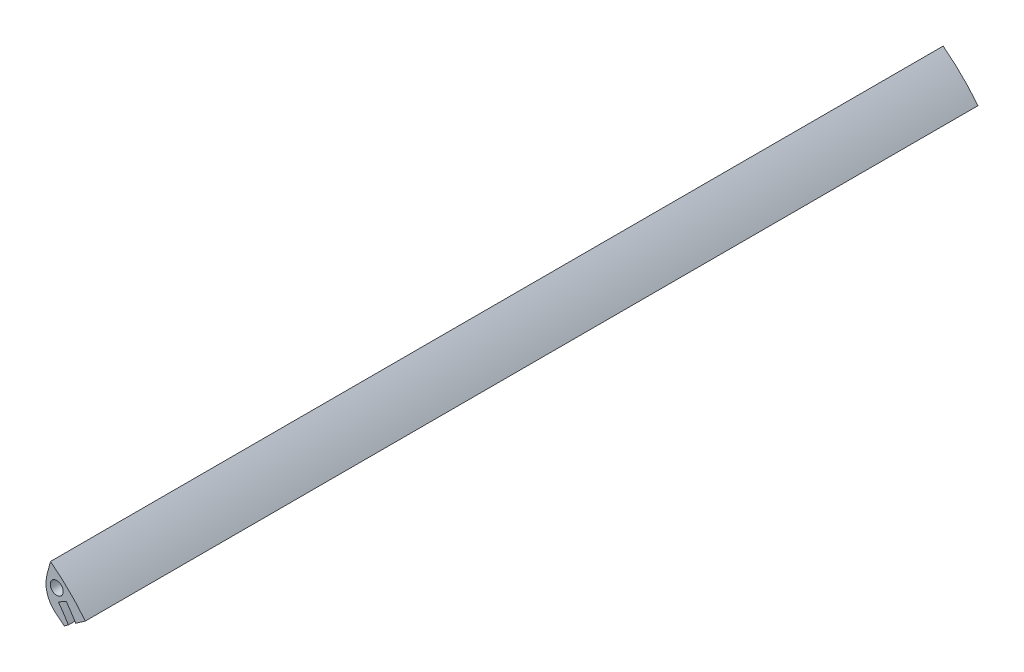
ISO-10303-21;
HEADER;
FILE_DESCRIPTION(('STEP AP214'),'2;1');
FILE_NAME('part.step','',(''),(''),'','','');
FILE_SCHEMA(('AUTOMOTIVE_DESIGN { 1 0 10303 214 1 1 1 1 }'));
ENDSEC;
DATA;
#1=APPLICATION_CONTEXT('core data for automotive mechanical design processes');
#2=APPLICATION_PROTOCOL_DEFINITION('international standard','automotive_design',2000,#1);
#3=PRODUCT_CONTEXT('',#1,'mechanical');
#4=PRODUCT('Part','Part','',(#3));
#5=PRODUCT_RELATED_PRODUCT_CATEGORY('part','',(#4));
#6=PRODUCT_DEFINITION_FORMATION('','',#4);
#7=PRODUCT_DEFINITION_CONTEXT('part definition',#1,'design');
#8=PRODUCT_DEFINITION('design','',#6,#7);
#9=PRODUCT_DEFINITION_SHAPE('','',#8);
#10=(LENGTH_UNIT() NAMED_UNIT(*) SI_UNIT(.MILLI.,.METRE.));
#11=(NAMED_UNIT(*) PLANE_ANGLE_UNIT() SI_UNIT($,.RADIAN.));
#12=(NAMED_UNIT(*) SI_UNIT($,.STERADIAN.) SOLID_ANGLE_UNIT());
#13=UNCERTAINTY_MEASURE_WITH_UNIT(LENGTH_MEASURE(1.E-05),#10,'distance_accuracy_value','');
#14=(GEOMETRIC_REPRESENTATION_CONTEXT(3) GLOBAL_UNCERTAINTY_ASSIGNED_CONTEXT((#13)) GLOBAL_UNIT_ASSIGNED_CONTEXT((#10,
#11,#12)) REPRESENTATION_CONTEXT('',''));
#15=CARTESIAN_POINT('',(0.,0.,0.));
#16=DIRECTION('',(0.,0.,1.));
#17=DIRECTION('',(1.,0.,0.));
#18=AXIS2_PLACEMENT_3D('',#15,#16,#17);
#19=CARTESIAN_POINT('',(29.0438400498833,23.7214113230388,200.));
#20=DIRECTION('',(-0.573576436351047,0.819152044288991,0.));
#21=DIRECTION('',(-0.819152044288991,-0.573576436351047,0.));
#22=AXIS2_PLACEMENT_3D('',#19,#20,#21);
#23=PLANE('',#22);
#24=DIRECTION('',(0.819152044288991,0.573576436351047,0.));
#25=VECTOR('',#24,1.);
#26=CARTESIAN_POINT('',(29.0438400498833,23.7214113230388,200.));
#27=LINE('',#26,#25);
#28=CARTESIAN_POINT('',(30.4767526299706,24.7247475132114,200.));
#29=VERTEX_POINT('',#28);
#30=CARTESIAN_POINT('',(31.4060281942667,25.3754332684056,200.));
#31=VERTEX_POINT('',#30);
#32=EDGE_CURVE('E172',#29,#31,#27,.T.);
#33=ORIENTED_EDGE('',*,*,#32,.F.);
#34=DIRECTION('',(0.,0.,-1.));
#35=VECTOR('',#34,1.);
#36=CARTESIAN_POINT('',(30.4767526299706,24.7247475132114,0.));
#37=LINE('',#36,#35);
#38=CARTESIAN_POINT('',(30.4767526299706,24.7247475132114,0.));
#39=VERTEX_POINT('',#38);
#40=EDGE_CURVE('E122',#29,#39,#37,.T.);
#41=ORIENTED_EDGE('',*,*,#40,.T.);
#42=DIRECTION('',(0.819152044288991,0.573576436351047,0.));
#43=VECTOR('',#42,1.);
#44=CARTESIAN_POINT('',(29.0438400498833,23.7214113230388,0.));
#45=LINE('',#44,#43);
#46=CARTESIAN_POINT('',(31.4060281942667,25.3754332684056,0.));
#47=VERTEX_POINT('',#46);
#48=EDGE_CURVE('E117',#39,#47,#45,.T.);
#49=ORIENTED_EDGE('',*,*,#48,.T.);
#50=DIRECTION('',(0.,0.,1.));
#51=VECTOR('',#50,1.);
#52=CARTESIAN_POINT('',(31.4060281942667,25.3754332684056,0.));
#53=LINE('',#52,#51);
#54=EDGE_CURVE('E120',#47,#31,#53,.T.);
#55=ORIENTED_EDGE('',*,*,#54,.T.);
#56=EDGE_LOOP('',(#33,#41,#49,#55));
#57=FACE_BOUND('',#56,.T.);
#58=ADVANCED_FACE('F41',(#57),#23,.F.);
#59=CARTESIAN_POINT('',(0.,0.,200.));
#60=DIRECTION('',(0.,0.,-1.));
#61=DIRECTION('',(-1.,0.,0.));
#62=AXIS2_PLACEMENT_3D('',#59,#60,#61);
#63=CYLINDRICAL_SURFACE('',#62,45.);
#64=CARTESIAN_POINT('',(0.,0.,0.));
#65=DIRECTION('',(0.,0.,1.));
#66=DIRECTION('',(-1.,0.,0.));
#67=AXIS2_PLACEMENT_3D('',#64,#65,#66);
#68=CIRCLE('',#67,45.);
#69=CARTESIAN_POINT('',(35.2015222143498,28.0330667924977,0.));
#70=VERTEX_POINT('',#69);
#71=CARTESIAN_POINT('',(27.3954375763557,35.7,0.));
#72=VERTEX_POINT('',#71);
#73=EDGE_CURVE('E163',#70,#72,#68,.T.);
#74=ORIENTED_EDGE('',*,*,#73,.T.);
#75=DIRECTION('',(0.,0.,-1.));
#76=VECTOR('',#75,1.);
#77=CARTESIAN_POINT('',(27.3954375763557,35.7,200.));
#78=LINE('',#77,#76);
#79=CARTESIAN_POINT('',(27.3954375763557,35.7,200.));
#80=VERTEX_POINT('',#79);
#81=EDGE_CURVE('E182',#80,#72,#78,.T.);
#82=ORIENTED_EDGE('',*,*,#81,.F.);
#83=CARTESIAN_POINT('',(0.,0.,200.));
#84=DIRECTION('',(0.,0.,1.));
#85=DIRECTION('',(-1.,0.,0.));
#86=AXIS2_PLACEMENT_3D('',#83,#84,#85);
#87=CIRCLE('',#86,45.);
#88=CARTESIAN_POINT('',(35.2015222143498,28.0330667924977,200.));
#89=VERTEX_POINT('',#88);
#90=EDGE_CURVE('E125',#89,#80,#87,.T.);
#91=ORIENTED_EDGE('',*,*,#90,.F.);
#92=DIRECTION('',(0.,0.,-1.));
#93=VECTOR('',#92,1.);
#94=CARTESIAN_POINT('',(35.2015222143498,28.0330667924977,200.));
#95=LINE('',#94,#93);
#96=EDGE_CURVE('E174',#89,#70,#95,.T.);
#97=ORIENTED_EDGE('',*,*,#96,.T.);
#98=EDGE_LOOP('',(#74,#82,#91,#97));
#99=FACE_BOUND('',#98,.T.);
#100=ADVANCED_FACE('F220',(#99),#63,.T.);
#101=CARTESIAN_POINT('',(25.2569128106269,27.7189169210557,200.));
#102=DIRECTION('',(0.965925826289069,-0.258819045102517,0.));
#103=DIRECTION('',(0.258819045102517,0.965925826289069,0.));
#104=AXIS2_PLACEMENT_3D('',#101,#102,#103);
#105=PLANE('',#104);
#106=DIRECTION('',(-0.258819045102517,-0.965925826289069,0.));
#107=VECTOR('',#106,1.);
#108=CARTESIAN_POINT('',(25.2569128106269,27.7189169210557,0.));
#109=LINE('',#108,#107);
#110=CARTESIAN_POINT('',(26.7099905064169,33.1418767090893,0.));
#111=VERTEX_POINT('',#110);
#112=EDGE_CURVE('E177',#72,#111,#109,.T.);
#113=ORIENTED_EDGE('',*,*,#112,.T.);
#114=DIRECTION('',(0.,0.,-1.));
#115=VECTOR('',#114,1.);
#116=CARTESIAN_POINT('',(26.7099905064169,33.1418767090893,200.));
#117=LINE('',#116,#115);
#118=CARTESIAN_POINT('',(26.7099905064169,33.1418767090893,200.));
#119=VERTEX_POINT('',#118);
#120=EDGE_CURVE('E187',#111,#119,#117,.F.);
#121=ORIENTED_EDGE('',*,*,#120,.T.);
#122=DIRECTION('',(-0.258819045102517,-0.965925826289069,0.));
#123=VECTOR('',#122,1.);
#124=CARTESIAN_POINT('',(25.2569128106269,27.7189169210557,200.));
#125=LINE('',#124,#123);
#126=EDGE_CURVE('E168',#80,#119,#125,.T.);
#127=ORIENTED_EDGE('',*,*,#126,.F.);
#128=ORIENTED_EDGE('',*,*,#81,.T.);
#129=EDGE_LOOP('',(#113,#121,#127,#128));
#130=FACE_BOUND('',#129,.T.);
#131=ADVANCED_FACE('F211',(#130),#105,.F.);
#132=CARTESIAN_POINT('',(33.0476140713222,26.5248840741385,200.));
#133=VERTEX_POINT('',#132);
#134=EDGE_CURVE('E171',#133,#89,#27,.T.);
#135=ORIENTED_EDGE('',*,*,#134,.F.);
#136=DIRECTION('',(0.,0.,1.));
#137=VECTOR('',#136,1.);
#138=CARTESIAN_POINT('',(33.0476140713222,26.5248840741385,0.));
#139=LINE('',#138,#137);
#140=CARTESIAN_POINT('',(33.0476140713222,26.5248840741385,0.));
#141=VERTEX_POINT('',#140);
#142=EDGE_CURVE('E136',#141,#133,#139,.T.);
#143=ORIENTED_EDGE('',*,*,#142,.F.);
#144=EDGE_CURVE('E126',#141,#70,#45,.T.);
#145=ORIENTED_EDGE('',*,*,#144,.T.);
#146=ORIENTED_EDGE('',*,*,#96,.F.);
#147=EDGE_LOOP('',(#135,#143,#145,#146));
#148=FACE_BOUND('',#147,.T.);
#149=ADVANCED_FACE('F222',(#148),#23,.F.);
#150=CARTESIAN_POINT('',(0.,0.,200.));
#151=DIRECTION('',(0.,0.,-1.));
#152=DIRECTION('',(-1.,0.,0.));
#153=AXIS2_PLACEMENT_3D('',#150,#151,#152);
#154=PLANE('',#153);
#155=CARTESIAN_POINT('',(28.7938366328269,31.2596380651164,200.));
#156=DIRECTION('',(0.,0.,1.));
#157=DIRECTION('',(1.,0.,0.));
#158=AXIS2_PLACEMENT_3D('',#155,#156,#157);
#159=CIRCLE('',#158,1.45);
#160=CARTESIAN_POINT('',(30.2438366328269,31.2596380651164,200.));
#161=VERTEX_POINT('',#160);
#162=EDGE_CURVE('E156',#161,#161,#159,.T.);
#163=ORIENTED_EDGE('',*,*,#162,.F.);
#164=EDGE_LOOP('',(#163));
#165=FACE_BOUND('',#164,.T.);
#166=CARTESIAN_POINT('',(36.3692487693076,30.5536862580641,200.));
#167=DIRECTION('',(0.,0.,-1.));
#168=DIRECTION('',(-1.,0.,0.));
#169=AXIS2_PLACEMENT_3D('',#166,#167,#168);
#170=CIRCLE('',#169,10.);
#171=CARTESIAN_POINT('',(26.4036052269831,31.3819065109709,200.));
#172=VERTEX_POINT('',#171);
#173=EDGE_CURVE('E189',#119,#172,#170,.F.);
#174=ORIENTED_EDGE('',*,*,#173,.T.);
#175=CARTESIAN_POINT('',(32.3829913523778,30.8849743592268,200.));
#176=DIRECTION('',(0.,0.,-1.));
#177=DIRECTION('',(-1.,0.,0.));
#178=AXIS2_PLACEMENT_3D('',#175,#176,#177);
#179=CIRCLE('',#178,6.);
#180=CARTESIAN_POINT('',(28.6325457852779,26.2015826343952,200.));
#181=VERTEX_POINT('',#180);
#182=EDGE_CURVE('E63',#172,#181,#179,.F.);
#183=ORIENTED_EDGE('',*,*,#182,.T.);
#184=DIRECTION('',(-0.780565287471933,0.625074261183308,0.));
#185=VECTOR('',#184,1.);
#186=CARTESIAN_POINT('',(30.4767526299706,24.7247475132114,200.));
#187=LINE('',#186,#185);
#188=EDGE_CURVE('E194',#181,#29,#187,.F.);
#189=ORIENTED_EDGE('',*,*,#188,.T.);
#190=ORIENTED_EDGE('',*,*,#32,.T.);
#191=CARTESIAN_POINT('',(-10.3244521101905,0.,200.));
#192=DIRECTION('',(0.,0.,-1.));
#193=DIRECTION('',(-1.,0.,0.));
#194=AXIS2_PLACEMENT_3D('',#191,#192,#193);
#195=CIRCLE('',#194,48.84);
#196=CARTESIAN_POINT('',(29.1567428171808,28.7503190783495,200.));
#197=VERTEX_POINT('',#196);
#198=EDGE_CURVE('E135',#197,#31,#195,.T.);
#199=ORIENTED_EDGE('',*,*,#198,.F.);
#200=DIRECTION('',(-0.889764116520494,-0.456420657894123,0.));
#201=VECTOR('',#200,1.);
#202=CARTESIAN_POINT('',(29.1567428171808,28.7503190783495,200.));
#203=LINE('',#202,#201);
#204=CARTESIAN_POINT('',(30.9571175153699,29.6738539669185,200.));
#205=VERTEX_POINT('',#204);
#206=EDGE_CURVE('E143',#205,#197,#203,.T.);
#207=ORIENTED_EDGE('',*,*,#206,.F.);
#208=CARTESIAN_POINT('',(-10.3244521101905,0.,200.));
#209=DIRECTION('',(0.,0.,1.));
#210=DIRECTION('',(-1.,0.,0.));
#211=AXIS2_PLACEMENT_3D('',#208,#209,#210);
#212=CIRCLE('',#211,50.84);
#213=EDGE_CURVE('E147',#133,#205,#212,.T.);
#214=ORIENTED_EDGE('',*,*,#213,.F.);
#215=ORIENTED_EDGE('',*,*,#134,.T.);
#216=ORIENTED_EDGE('',*,*,#90,.T.);
#217=ORIENTED_EDGE('',*,*,#126,.T.);
#218=EDGE_LOOP('',(#174,#183,#189,#190,#199,#207,#214,#215,#216,#217));
#219=FACE_BOUND('',#218,.T.);
#220=ADVANCED_FACE('F207',(#165,#219),#154,.F.);
#221=CARTESIAN_POINT('',(0.,0.,0.));
#222=DIRECTION('',(0.,0.,-1.));
#223=DIRECTION('',(-1.,0.,0.));
#224=AXIS2_PLACEMENT_3D('',#221,#222,#223);
#225=PLANE('',#224);
#226=DIRECTION('',(0.780565287471933,-0.625074261183308,0.));
#227=VECTOR('',#226,1.);
#228=CARTESIAN_POINT('',(23.9712936825896,29.9342988607517,0.));
#229=LINE('',#228,#227);
#230=CARTESIAN_POINT('',(28.6325457852779,26.2015826343952,0.));
#231=VERTEX_POINT('',#230);
#232=EDGE_CURVE('E192',#39,#231,#229,.F.);
#233=ORIENTED_EDGE('',*,*,#232,.T.);
#234=CARTESIAN_POINT('',(32.3829913523778,30.8849743592268,0.));
#235=DIRECTION('',(0.,0.,-1.));
#236=DIRECTION('',(-1.,0.,0.));
#237=AXIS2_PLACEMENT_3D('',#234,#235,#236);
#238=CIRCLE('',#237,6.);
#239=CARTESIAN_POINT('',(26.4036052269831,31.3819065109709,0.));
#240=VERTEX_POINT('',#239);
#241=EDGE_CURVE('E11',#231,#240,#238,.T.);
#242=ORIENTED_EDGE('',*,*,#241,.T.);
#243=CARTESIAN_POINT('',(36.3692487693076,30.5536862580641,0.));
#244=DIRECTION('',(0.,0.,-1.));
#245=DIRECTION('',(-1.,0.,0.));
#246=AXIS2_PLACEMENT_3D('',#243,#244,#245);
#247=CIRCLE('',#246,10.);
#248=EDGE_CURVE('E185',#240,#111,#247,.T.);
#249=ORIENTED_EDGE('',*,*,#248,.T.);
#250=ORIENTED_EDGE('',*,*,#112,.F.);
#251=ORIENTED_EDGE('',*,*,#73,.F.);
#252=ORIENTED_EDGE('',*,*,#144,.F.);
#253=CARTESIAN_POINT('',(-10.3244521101905,0.,0.));
#254=DIRECTION('',(0.,0.,1.));
#255=DIRECTION('',(-1.,0.,0.));
#256=AXIS2_PLACEMENT_3D('',#253,#254,#255);
#257=CIRCLE('',#256,50.84);
#258=CARTESIAN_POINT('',(30.9571175153699,29.6738539669185,0.));
#259=VERTEX_POINT('',#258);
#260=EDGE_CURVE('E142',#141,#259,#257,.T.);
#261=ORIENTED_EDGE('',*,*,#260,.T.);
#262=DIRECTION('',(-0.889764116520494,-0.456420657894123,0.));
#263=VECTOR('',#262,1.);
#264=CARTESIAN_POINT('',(29.1567428171808,28.7503190783495,0.));
#265=LINE('',#264,#263);
#266=CARTESIAN_POINT('',(29.1567428171808,28.7503190783495,0.));
#267=VERTEX_POINT('',#266);
#268=EDGE_CURVE('E137',#259,#267,#265,.T.);
#269=ORIENTED_EDGE('',*,*,#268,.T.);
#270=CARTESIAN_POINT('',(-10.3244521101905,0.,0.));
#271=DIRECTION('',(0.,0.,-1.));
#272=DIRECTION('',(-1.,0.,0.));
#273=AXIS2_PLACEMENT_3D('',#270,#271,#272);
#274=CIRCLE('',#273,48.84);
#275=EDGE_CURVE('E132',#267,#47,#274,.T.);
#276=ORIENTED_EDGE('',*,*,#275,.T.);
#277=ORIENTED_EDGE('',*,*,#48,.F.);
#278=EDGE_LOOP('',(#233,#242,#249,#250,#251,#252,#261,#269,#276,#277));
#279=FACE_BOUND('',#278,.T.);
#280=CARTESIAN_POINT('',(28.7938366328269,31.2596380651164,0.));
#281=DIRECTION('',(0.,0.,1.));
#282=DIRECTION('',(1.,0.,0.));
#283=AXIS2_PLACEMENT_3D('',#280,#281,#282);
#284=CIRCLE('',#283,1.45);
#285=CARTESIAN_POINT('',(30.2438366328269,31.2596380651164,0.));
#286=VERTEX_POINT('',#285);
#287=EDGE_CURVE('E160',#286,#286,#284,.T.);
#288=ORIENTED_EDGE('',*,*,#287,.T.);
#289=EDGE_LOOP('',(#288));
#290=FACE_BOUND('',#289,.T.);
#291=ADVANCED_FACE('F139',(#279,#290),#225,.T.);
#292=CARTESIAN_POINT('',(28.7938366328269,31.2596380651164,0.));
#293=DIRECTION('',(0.,0.,1.));
#294=DIRECTION('',(1.,0.,0.));
#295=AXIS2_PLACEMENT_3D('',#292,#293,#294);
#296=CYLINDRICAL_SURFACE('',#295,1.45);
#297=ORIENTED_EDGE('',*,*,#287,.F.);
#298=EDGE_LOOP('',(#297));
#299=FACE_BOUND('',#298,.T.);
#300=ORIENTED_EDGE('',*,*,#162,.T.);
#301=EDGE_LOOP('',(#300));
#302=FACE_BOUND('',#301,.T.);
#303=ADVANCED_FACE('F256',(#299,#302),#296,.F.);
#304=CARTESIAN_POINT('',(-10.3244521101905,0.,0.));
#305=DIRECTION('',(0.,0.,1.));
#306=DIRECTION('',(1.,0.,0.));
#307=AXIS2_PLACEMENT_3D('',#304,#305,#306);
#308=CYLINDRICAL_SURFACE('',#307,48.84);
#309=ORIENTED_EDGE('',*,*,#198,.T.);
#310=ORIENTED_EDGE('',*,*,#54,.F.);
#311=ORIENTED_EDGE('',*,*,#275,.F.);
#312=DIRECTION('',(0.,0.,1.));
#313=VECTOR('',#312,1.);
#314=CARTESIAN_POINT('',(29.1567428171808,28.7503190783495,0.));
#315=LINE('',#314,#313);
#316=EDGE_CURVE('E154',#267,#197,#315,.T.);
#317=ORIENTED_EDGE('',*,*,#316,.T.);
#318=EDGE_LOOP('',(#309,#310,#311,#317));
#319=FACE_BOUND('',#318,.T.);
#320=ADVANCED_FACE('F131',(#319),#308,.T.);
#321=CARTESIAN_POINT('',(29.1567428171808,28.7503190783495,0.));
#322=DIRECTION('',(-0.456420657894123,0.889764116520494,0.));
#323=DIRECTION('',(-0.889764116520494,-0.456420657894123,0.));
#324=AXIS2_PLACEMENT_3D('',#321,#322,#323);
#325=PLANE('',#324);
#326=ORIENTED_EDGE('',*,*,#206,.T.);
#327=ORIENTED_EDGE('',*,*,#316,.F.);
#328=ORIENTED_EDGE('',*,*,#268,.F.);
#329=DIRECTION('',(0.,0.,1.));
#330=VECTOR('',#329,1.);
#331=CARTESIAN_POINT('',(30.9571175153699,29.6738539669185,0.));
#332=LINE('',#331,#330);
#333=EDGE_CURVE('E157',#259,#205,#332,.T.);
#334=ORIENTED_EDGE('',*,*,#333,.T.);
#335=EDGE_LOOP('',(#326,#327,#328,#334));
#336=FACE_BOUND('',#335,.T.);
#337=ADVANCED_FACE('F249',(#336),#325,.F.);
#338=CARTESIAN_POINT('',(-10.3244521101905,0.,0.));
#339=DIRECTION('',(0.,0.,1.));
#340=DIRECTION('',(1.,0.,0.));
#341=AXIS2_PLACEMENT_3D('',#338,#339,#340);
#342=CYLINDRICAL_SURFACE('',#341,50.84);
#343=ORIENTED_EDGE('',*,*,#213,.T.);
#344=ORIENTED_EDGE('',*,*,#333,.F.);
#345=ORIENTED_EDGE('',*,*,#260,.F.);
#346=ORIENTED_EDGE('',*,*,#142,.T.);
#347=EDGE_LOOP('',(#343,#344,#345,#346));
#348=FACE_BOUND('',#347,.T.);
#349=ADVANCED_FACE('F247',(#348),#342,.F.);
#350=CARTESIAN_POINT('',(36.3692487693076,30.5536862580641,200.));
#351=DIRECTION('',(0.,0.,-1.));
#352=DIRECTION('',(-1.,0.,0.));
#353=AXIS2_PLACEMENT_3D('',#350,#351,#352);
#354=CYLINDRICAL_SURFACE('',#353,10.);
#355=ORIENTED_EDGE('',*,*,#248,.F.);
#356=DIRECTION('',(0.,0.,-1.));
#357=VECTOR('',#356,1.);
#358=CARTESIAN_POINT('',(26.4036052269831,31.3819065109709,200.));
#359=LINE('',#358,#357);
#360=EDGE_CURVE('E196',#240,#172,#359,.F.);
#361=ORIENTED_EDGE('',*,*,#360,.T.);
#362=ORIENTED_EDGE('',*,*,#173,.F.);
#363=ORIENTED_EDGE('',*,*,#120,.F.);
#364=EDGE_LOOP('',(#355,#361,#362,#363));
#365=FACE_BOUND('',#364,.T.);
#366=ADVANCED_FACE('F203',(#365),#354,.T.);
#367=CARTESIAN_POINT('',(30.4767526299706,24.7247475132114,200.));
#368=DIRECTION('',(0.625074261183308,0.780565287471933,0.));
#369=DIRECTION('',(0.,0.,-1.));
#370=AXIS2_PLACEMENT_3D('',#367,#368,#369);
#371=PLANE('',#370);
#372=ORIENTED_EDGE('',*,*,#188,.F.);
#373=DIRECTION('',(0.,0.,1.));
#374=VECTOR('',#373,1.);
#375=CARTESIAN_POINT('',(28.6325457852779,26.2015826343952,200.));
#376=LINE('',#375,#374);
#377=EDGE_CURVE('E49',#181,#231,#376,.F.);
#378=ORIENTED_EDGE('',*,*,#377,.T.);
#379=ORIENTED_EDGE('',*,*,#232,.F.);
#380=ORIENTED_EDGE('',*,*,#40,.F.);
#381=EDGE_LOOP('',(#372,#378,#379,#380));
#382=FACE_BOUND('',#381,.T.);
#383=ADVANCED_FACE('F215',(#382),#371,.F.);
#384=CARTESIAN_POINT('',(32.3829913523778,30.8849743592268,200.));
#385=DIRECTION('',(0.,0.,-1.));
#386=DIRECTION('',(-1.,0.,0.));
#387=AXIS2_PLACEMENT_3D('',#384,#385,#386);
#388=CYLINDRICAL_SURFACE('',#387,6.);
#389=ORIENTED_EDGE('',*,*,#241,.F.);
#390=ORIENTED_EDGE('',*,*,#377,.F.);
#391=ORIENTED_EDGE('',*,*,#182,.F.);
#392=ORIENTED_EDGE('',*,*,#360,.F.);
#393=EDGE_LOOP('',(#389,#390,#391,#392));
#394=FACE_BOUND('',#393,.T.);
#395=ADVANCED_FACE('F43',(#394),#388,.T.);
#396=CLOSED_SHELL('',(#58,#100,#131,#149,#220,#291,#303,#320,#337,#349,#366,#383,#395));
#397=MANIFOLD_SOLID_BREP('B2',#396);
#398=ADVANCED_BREP_SHAPE_REPRESENTATION('',(#18,#397),#14);
#399=SHAPE_DEFINITION_REPRESENTATION(#9,#398);
ENDSEC;
END-ISO-10303-21;
